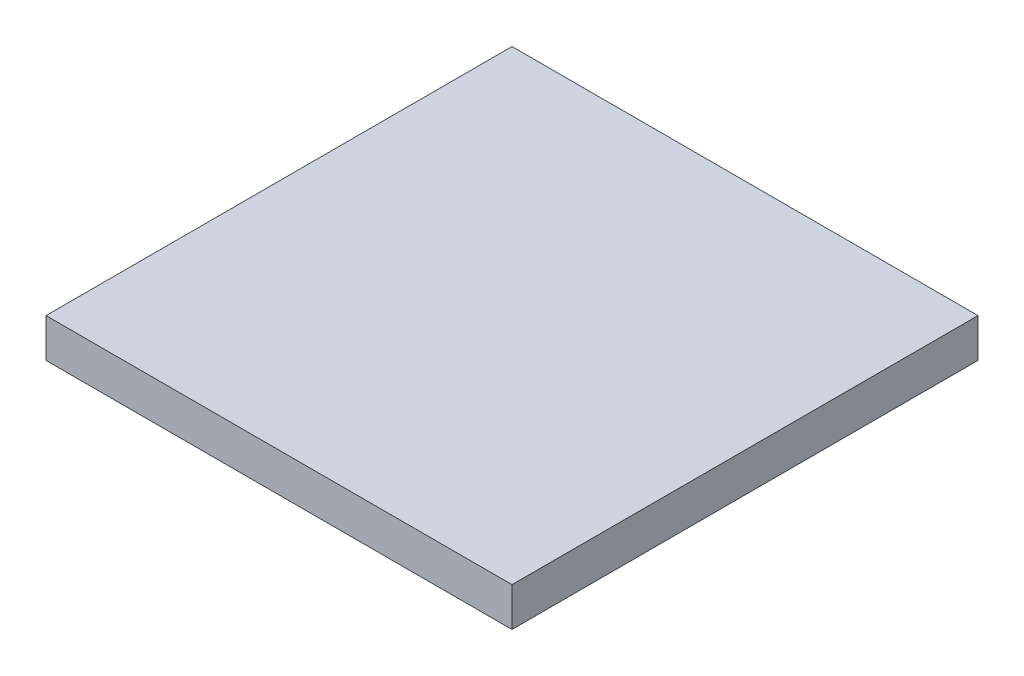
ISO-10303-21;
HEADER;
FILE_DESCRIPTION(('STEP AP214'),'2;1');
FILE_NAME('part.step','',(''),(''),'','','');
FILE_SCHEMA(('AUTOMOTIVE_DESIGN { 1 0 10303 214 1 1 1 1 }'));
ENDSEC;
DATA;
#1=APPLICATION_CONTEXT('core data for automotive mechanical design processes');
#2=APPLICATION_PROTOCOL_DEFINITION('international standard','automotive_design',2000,#1);
#3=PRODUCT_CONTEXT('',#1,'mechanical');
#4=PRODUCT('Part','Part','',(#3));
#5=PRODUCT_RELATED_PRODUCT_CATEGORY('part','',(#4));
#6=PRODUCT_DEFINITION_FORMATION('','',#4);
#7=PRODUCT_DEFINITION_CONTEXT('part definition',#1,'design');
#8=PRODUCT_DEFINITION('design','',#6,#7);
#9=PRODUCT_DEFINITION_SHAPE('','',#8);
#10=(LENGTH_UNIT() NAMED_UNIT(*) SI_UNIT(.MILLI.,.METRE.));
#11=(NAMED_UNIT(*) PLANE_ANGLE_UNIT() SI_UNIT($,.RADIAN.));
#12=(NAMED_UNIT(*) SI_UNIT($,.STERADIAN.) SOLID_ANGLE_UNIT());
#13=UNCERTAINTY_MEASURE_WITH_UNIT(LENGTH_MEASURE(1.E-05),#10,'distance_accuracy_value','');
#14=(GEOMETRIC_REPRESENTATION_CONTEXT(3) GLOBAL_UNCERTAINTY_ASSIGNED_CONTEXT((#13)) GLOBAL_UNIT_ASSIGNED_CONTEXT((#10,
#11,#12)) REPRESENTATION_CONTEXT('',''));
#15=CARTESIAN_POINT('',(0.,0.,0.));
#16=DIRECTION('',(0.,0.,1.));
#17=DIRECTION('',(1.,0.,0.));
#18=AXIS2_PLACEMENT_3D('',#15,#16,#17);
#19=CARTESIAN_POINT('',(-61.4436856109624,15.,-45.754586485769));
#20=DIRECTION('',(1.,0.,0.));
#21=DIRECTION('',(0.,0.,-1.));
#22=AXIS2_PLACEMENT_3D('',#19,#20,#21);
#23=PLANE('',#22);
#24=DIRECTION('',(0.,0.,1.));
#25=VECTOR('',#24,1.);
#26=CARTESIAN_POINT('',(-61.4436856109624,0.,-45.754586485769));
#27=LINE('',#26,#25);
#28=CARTESIAN_POINT('',(-61.4436856109624,0.,-45.754586485769));
#29=VERTEX_POINT('',#28);
#30=CARTESIAN_POINT('',(-61.4436856109623,0.,134.245413514231));
#31=VERTEX_POINT('',#30);
#32=EDGE_CURVE('E99',#29,#31,#27,.T.);
#33=ORIENTED_EDGE('',*,*,#32,.T.);
#34=DIRECTION('',(0.,-1.,0.));
#35=VECTOR('',#34,1.);
#36=CARTESIAN_POINT('',(-61.4436856109623,15.,134.245413514231));
#37=LINE('',#36,#35);
#38=CARTESIAN_POINT('',(-61.4436856109623,15.,134.245413514231));
#39=VERTEX_POINT('',#38);
#40=EDGE_CURVE('E11',#39,#31,#37,.T.);
#41=ORIENTED_EDGE('',*,*,#40,.F.);
#42=DIRECTION('',(0.,0.,1.));
#43=VECTOR('',#42,1.);
#44=CARTESIAN_POINT('',(-61.4436856109624,15.,-45.754586485769));
#45=LINE('',#44,#43);
#46=CARTESIAN_POINT('',(-61.4436856109624,15.,-45.754586485769));
#47=VERTEX_POINT('',#46);
#48=EDGE_CURVE('E87',#47,#39,#45,.T.);
#49=ORIENTED_EDGE('',*,*,#48,.F.);
#50=DIRECTION('',(0.,-1.,0.));
#51=VECTOR('',#50,1.);
#52=CARTESIAN_POINT('',(-61.4436856109624,15.,-45.754586485769));
#53=LINE('',#52,#51);
#54=EDGE_CURVE('E95',#47,#29,#53,.T.);
#55=ORIENTED_EDGE('',*,*,#54,.T.);
#56=EDGE_LOOP('',(#33,#41,#49,#55));
#57=FACE_BOUND('',#56,.T.);
#58=ADVANCED_FACE('F36',(#57),#23,.F.);
#59=CARTESIAN_POINT('',(-61.4436856109623,15.,134.245413514231));
#60=DIRECTION('',(0.,0.,-1.));
#61=DIRECTION('',(-1.,0.,0.));
#62=AXIS2_PLACEMENT_3D('',#59,#60,#61);
#63=PLANE('',#62);
#64=DIRECTION('',(1.,0.,0.));
#65=VECTOR('',#64,1.);
#66=CARTESIAN_POINT('',(-61.4436856109623,0.,134.245413514231));
#67=LINE('',#66,#65);
#68=CARTESIAN_POINT('',(118.556314389038,0.,134.245413514231));
#69=VERTEX_POINT('',#68);
#70=EDGE_CURVE('E91',#31,#69,#67,.T.);
#71=ORIENTED_EDGE('',*,*,#70,.T.);
#72=DIRECTION('',(0.,-1.,0.));
#73=VECTOR('',#72,1.);
#74=CARTESIAN_POINT('',(118.556314389038,15.,134.245413514231));
#75=LINE('',#74,#73);
#76=CARTESIAN_POINT('',(118.556314389038,15.,134.245413514231));
#77=VERTEX_POINT('',#76);
#78=EDGE_CURVE('E44',#77,#69,#75,.T.);
#79=ORIENTED_EDGE('',*,*,#78,.F.);
#80=DIRECTION('',(1.,0.,0.));
#81=VECTOR('',#80,1.);
#82=CARTESIAN_POINT('',(-61.4436856109623,15.,134.245413514231));
#83=LINE('',#82,#81);
#84=EDGE_CURVE('E82',#39,#77,#83,.T.);
#85=ORIENTED_EDGE('',*,*,#84,.F.);
#86=ORIENTED_EDGE('',*,*,#40,.T.);
#87=EDGE_LOOP('',(#71,#79,#85,#86));
#88=FACE_BOUND('',#87,.T.);
#89=ADVANCED_FACE('F90',(#88),#63,.F.);
#90=CARTESIAN_POINT('',(118.556314389038,15.,-45.754586485769));
#91=DIRECTION('',(-1.,0.,0.));
#92=DIRECTION('',(0.,0.,1.));
#93=AXIS2_PLACEMENT_3D('',#90,#91,#92);
#94=PLANE('',#93);
#95=DIRECTION('',(0.,0.,-1.));
#96=VECTOR('',#95,1.);
#97=CARTESIAN_POINT('',(118.556314389038,0.,-45.754586485769));
#98=LINE('',#97,#96);
#99=CARTESIAN_POINT('',(118.556314389038,0.,-45.754586485769));
#100=VERTEX_POINT('',#99);
#101=EDGE_CURVE('E69',#69,#100,#98,.T.);
#102=ORIENTED_EDGE('',*,*,#101,.T.);
#103=DIRECTION('',(0.,-1.,0.));
#104=VECTOR('',#103,1.);
#105=CARTESIAN_POINT('',(118.556314389038,15.,-45.754586485769));
#106=LINE('',#105,#104);
#107=CARTESIAN_POINT('',(118.556314389038,15.,-45.754586485769));
#108=VERTEX_POINT('',#107);
#109=EDGE_CURVE('E92',#108,#100,#106,.T.);
#110=ORIENTED_EDGE('',*,*,#109,.F.);
#111=DIRECTION('',(0.,0.,-1.));
#112=VECTOR('',#111,1.);
#113=CARTESIAN_POINT('',(118.556314389038,15.,-45.754586485769));
#114=LINE('',#113,#112);
#115=EDGE_CURVE('E85',#77,#108,#114,.T.);
#116=ORIENTED_EDGE('',*,*,#115,.F.);
#117=ORIENTED_EDGE('',*,*,#78,.T.);
#118=EDGE_LOOP('',(#102,#110,#116,#117));
#119=FACE_BOUND('',#118,.T.);
#120=ADVANCED_FACE('F93',(#119),#94,.F.);
#121=CARTESIAN_POINT('',(-61.4436856109624,15.,-45.754586485769));
#122=DIRECTION('',(0.,0.,1.));
#123=DIRECTION('',(1.,0.,0.));
#124=AXIS2_PLACEMENT_3D('',#121,#122,#123);
#125=PLANE('',#124);
#126=DIRECTION('',(-1.,0.,0.));
#127=VECTOR('',#126,1.);
#128=CARTESIAN_POINT('',(-61.4436856109624,0.,-45.754586485769));
#129=LINE('',#128,#127);
#130=EDGE_CURVE('E75',#100,#29,#129,.T.);
#131=ORIENTED_EDGE('',*,*,#130,.T.);
#132=ORIENTED_EDGE('',*,*,#54,.F.);
#133=DIRECTION('',(-1.,0.,0.));
#134=VECTOR('',#133,1.);
#135=CARTESIAN_POINT('',(-61.4436856109624,15.,-45.754586485769));
#136=LINE('',#135,#134);
#137=EDGE_CURVE('E52',#108,#47,#136,.T.);
#138=ORIENTED_EDGE('',*,*,#137,.F.);
#139=ORIENTED_EDGE('',*,*,#109,.T.);
#140=EDGE_LOOP('',(#131,#132,#138,#139));
#141=FACE_BOUND('',#140,.T.);
#142=ADVANCED_FACE('F106',(#141),#125,.F.);
#143=CARTESIAN_POINT('',(0.,15.,0.));
#144=DIRECTION('',(0.,1.,0.));
#145=DIRECTION('',(0.,0.,1.));
#146=AXIS2_PLACEMENT_3D('',#143,#144,#145);
#147=PLANE('',#146);
#148=ORIENTED_EDGE('',*,*,#48,.T.);
#149=ORIENTED_EDGE('',*,*,#84,.T.);
#150=ORIENTED_EDGE('',*,*,#115,.T.);
#151=ORIENTED_EDGE('',*,*,#137,.T.);
#152=EDGE_LOOP('',(#148,#149,#150,#151));
#153=FACE_BOUND('',#152,.T.);
#154=ADVANCED_FACE('F83',(#153),#147,.T.);
#155=CARTESIAN_POINT('',(0.,0.,0.));
#156=DIRECTION('',(0.,1.,0.));
#157=DIRECTION('',(0.,0.,1.));
#158=AXIS2_PLACEMENT_3D('',#155,#156,#157);
#159=PLANE('',#158);
#160=ORIENTED_EDGE('',*,*,#32,.F.);
#161=ORIENTED_EDGE('',*,*,#130,.F.);
#162=ORIENTED_EDGE('',*,*,#101,.F.);
#163=ORIENTED_EDGE('',*,*,#70,.F.);
#164=EDGE_LOOP('',(#160,#161,#162,#163));
#165=FACE_BOUND('',#164,.T.);
#166=ADVANCED_FACE('F109',(#165),#159,.F.);
#167=CLOSED_SHELL('',(#58,#89,#120,#142,#154,#166));
#168=MANIFOLD_SOLID_BREP('B2',#167);
#169=ADVANCED_BREP_SHAPE_REPRESENTATION('',(#18,#168),#14);
#170=SHAPE_DEFINITION_REPRESENTATION(#9,#169);
ENDSEC;
END-ISO-10303-21;
